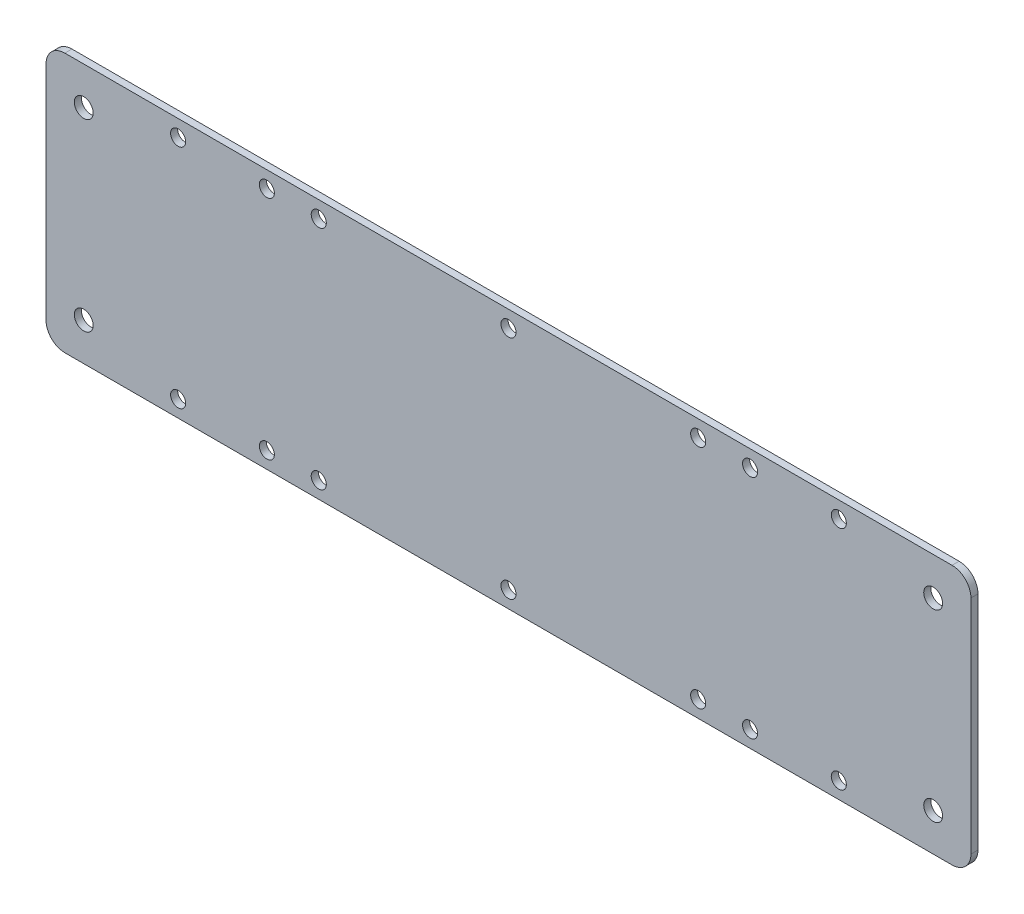
ISO-10303-21;
HEADER;
FILE_DESCRIPTION(('STEP AP214'),'2;1');
FILE_NAME('part.step','',(''),(''),'','','');
FILE_SCHEMA(('AUTOMOTIVE_DESIGN { 1 0 10303 214 1 1 1 1 }'));
ENDSEC;
DATA;
#1=APPLICATION_CONTEXT('core data for automotive mechanical design processes');
#2=APPLICATION_PROTOCOL_DEFINITION('international standard','automotive_design',2000,#1);
#3=PRODUCT_CONTEXT('',#1,'mechanical');
#4=PRODUCT('Part','Part','',(#3));
#5=PRODUCT_RELATED_PRODUCT_CATEGORY('part','',(#4));
#6=PRODUCT_DEFINITION_FORMATION('','',#4);
#7=PRODUCT_DEFINITION_CONTEXT('part definition',#1,'design');
#8=PRODUCT_DEFINITION('design','',#6,#7);
#9=PRODUCT_DEFINITION_SHAPE('','',#8);
#10=(LENGTH_UNIT() NAMED_UNIT(*) SI_UNIT(.MILLI.,.METRE.));
#11=(NAMED_UNIT(*) PLANE_ANGLE_UNIT() SI_UNIT($,.RADIAN.));
#12=(NAMED_UNIT(*) SI_UNIT($,.STERADIAN.) SOLID_ANGLE_UNIT());
#13=UNCERTAINTY_MEASURE_WITH_UNIT(LENGTH_MEASURE(1.E-05),#10,'distance_accuracy_value','');
#14=(GEOMETRIC_REPRESENTATION_CONTEXT(3) GLOBAL_UNCERTAINTY_ASSIGNED_CONTEXT((#13)) GLOBAL_UNIT_ASSIGNED_CONTEXT((#10,
#11,#12)) REPRESENTATION_CONTEXT('',''));
#15=CARTESIAN_POINT('',(0.,0.,0.));
#16=DIRECTION('',(0.,0.,1.));
#17=DIRECTION('',(1.,0.,0.));
#18=AXIS2_PLACEMENT_3D('',#15,#16,#17);
#19=CARTESIAN_POINT('',(-98.,27.4999999999999,1.5));
#20=DIRECTION('',(1.,0.,0.));
#21=DIRECTION('',(0.,1.,0.));
#22=AXIS2_PLACEMENT_3D('',#19,#20,#21);
#23=PLANE('',#22);
#24=DIRECTION('',(0.,-1.,0.));
#25=VECTOR('',#24,1.);
#26=CARTESIAN_POINT('',(-98.,27.4999999999999,0.));
#27=LINE('',#26,#25);
#28=CARTESIAN_POINT('',(-98.,23.4999999999999,0.));
#29=VERTEX_POINT('',#28);
#30=CARTESIAN_POINT('',(-98.,-23.5,0.));
#31=VERTEX_POINT('',#30);
#32=EDGE_CURVE('E151',#29,#31,#27,.T.);
#33=ORIENTED_EDGE('',*,*,#32,.T.);
#34=DIRECTION('',(0.,0.,-1.));
#35=VECTOR('',#34,1.);
#36=CARTESIAN_POINT('',(-98.,-23.5,1.5));
#37=LINE('',#36,#35);
#38=CARTESIAN_POINT('',(-98.,-23.5,1.5));
#39=VERTEX_POINT('',#38);
#40=EDGE_CURVE('E11',#31,#39,#37,.F.);
#41=ORIENTED_EDGE('',*,*,#40,.T.);
#42=DIRECTION('',(0.,-1.,0.));
#43=VECTOR('',#42,1.);
#44=CARTESIAN_POINT('',(-98.,27.4999999999999,1.5));
#45=LINE('',#44,#43);
#46=CARTESIAN_POINT('',(-98.,23.4999999999999,1.5));
#47=VERTEX_POINT('',#46);
#48=EDGE_CURVE('E154',#47,#39,#45,.T.);
#49=ORIENTED_EDGE('',*,*,#48,.F.);
#50=DIRECTION('',(0.,0.,-1.));
#51=VECTOR('',#50,1.);
#52=CARTESIAN_POINT('',(-98.,23.4999999999999,0.));
#53=LINE('',#52,#51);
#54=EDGE_CURVE('E40',#47,#29,#53,.T.);
#55=ORIENTED_EDGE('',*,*,#54,.T.);
#56=EDGE_LOOP('',(#33,#41,#49,#55));
#57=FACE_BOUND('',#56,.T.);
#58=ADVANCED_FACE('F32',(#57),#23,.F.);
#59=CARTESIAN_POINT('',(-98.,-27.5,1.5));
#60=DIRECTION('',(0.,1.,0.));
#61=DIRECTION('',(0.,0.,1.));
#62=AXIS2_PLACEMENT_3D('',#59,#60,#61);
#63=PLANE('',#62);
#64=DIRECTION('',(1.,0.,0.));
#65=VECTOR('',#64,1.);
#66=CARTESIAN_POINT('',(-98.,-27.5,0.));
#67=LINE('',#66,#65);
#68=CARTESIAN_POINT('',(-94.,-27.5,0.));
#69=VERTEX_POINT('',#68);
#70=CARTESIAN_POINT('',(94.,-27.5,0.));
#71=VERTEX_POINT('',#70);
#72=EDGE_CURVE('E117',#69,#71,#67,.T.);
#73=ORIENTED_EDGE('',*,*,#72,.T.);
#74=DIRECTION('',(0.,0.,-1.));
#75=VECTOR('',#74,1.);
#76=CARTESIAN_POINT('',(94.,-27.5,1.5));
#77=LINE('',#76,#75);
#78=CARTESIAN_POINT('',(94.,-27.5,1.5));
#79=VERTEX_POINT('',#78);
#80=EDGE_CURVE('E134',#71,#79,#77,.F.);
#81=ORIENTED_EDGE('',*,*,#80,.T.);
#82=DIRECTION('',(1.,0.,0.));
#83=VECTOR('',#82,1.);
#84=CARTESIAN_POINT('',(-98.,-27.5,1.5));
#85=LINE('',#84,#83);
#86=CARTESIAN_POINT('',(-94.,-27.5,1.5));
#87=VERTEX_POINT('',#86);
#88=EDGE_CURVE('E167',#87,#79,#85,.T.);
#89=ORIENTED_EDGE('',*,*,#88,.F.);
#90=DIRECTION('',(0.,0.,-1.));
#91=VECTOR('',#90,1.);
#92=CARTESIAN_POINT('',(-94.,-27.5,1.5));
#93=LINE('',#92,#91);
#94=EDGE_CURVE('E131',#87,#69,#93,.T.);
#95=ORIENTED_EDGE('',*,*,#94,.T.);
#96=EDGE_LOOP('',(#73,#81,#89,#95));
#97=FACE_BOUND('',#96,.T.);
#98=ADVANCED_FACE('F318',(#97),#63,.F.);
#99=CARTESIAN_POINT('',(98.,27.5,1.5));
#100=DIRECTION('',(1.,0.,0.));
#101=DIRECTION('',(0.,1.,0.));
#102=AXIS2_PLACEMENT_3D('',#99,#100,#101);
#103=PLANE('',#102);
#104=DIRECTION('',(0.,-1.,0.));
#105=VECTOR('',#104,1.);
#106=CARTESIAN_POINT('',(98.,27.5,1.5));
#107=LINE('',#106,#105);
#108=CARTESIAN_POINT('',(98.,23.5,1.5));
#109=VERTEX_POINT('',#108);
#110=CARTESIAN_POINT('',(98.,-23.5,1.5));
#111=VERTEX_POINT('',#110);
#112=EDGE_CURVE('E124',#109,#111,#107,.T.);
#113=ORIENTED_EDGE('',*,*,#112,.T.);
#114=DIRECTION('',(0.,0.,-1.));
#115=VECTOR('',#114,1.);
#116=CARTESIAN_POINT('',(98.,-23.5,0.));
#117=LINE('',#116,#115);
#118=CARTESIAN_POINT('',(98.,-23.5,0.));
#119=VERTEX_POINT('',#118);
#120=EDGE_CURVE('E116',#111,#119,#117,.T.);
#121=ORIENTED_EDGE('',*,*,#120,.T.);
#122=DIRECTION('',(0.,-1.,0.));
#123=VECTOR('',#122,1.);
#124=CARTESIAN_POINT('',(98.,27.5,0.));
#125=LINE('',#124,#123);
#126=CARTESIAN_POINT('',(98.,23.5,0.));
#127=VERTEX_POINT('',#126);
#128=EDGE_CURVE('E101',#127,#119,#125,.T.);
#129=ORIENTED_EDGE('',*,*,#128,.F.);
#130=DIRECTION('',(0.,0.,-1.));
#131=VECTOR('',#130,1.);
#132=CARTESIAN_POINT('',(98.,23.5,1.5));
#133=LINE('',#132,#131);
#134=EDGE_CURVE('E114',#127,#109,#133,.F.);
#135=ORIENTED_EDGE('',*,*,#134,.T.);
#136=EDGE_LOOP('',(#113,#121,#129,#135));
#137=FACE_BOUND('',#136,.T.);
#138=ADVANCED_FACE('F113',(#137),#103,.T.);
#139=CARTESIAN_POINT('',(-98.,27.4999999999999,1.5));
#140=DIRECTION('',(0.,1.,0.));
#141=DIRECTION('',(-1.,0.,0.));
#142=AXIS2_PLACEMENT_3D('',#139,#140,#141);
#143=PLANE('',#142);
#144=DIRECTION('',(1.,0.,0.));
#145=VECTOR('',#144,1.);
#146=CARTESIAN_POINT('',(-98.,27.4999999999999,1.5));
#147=LINE('',#146,#145);
#148=CARTESIAN_POINT('',(-94.,27.4999999999999,1.5));
#149=VERTEX_POINT('',#148);
#150=CARTESIAN_POINT('',(94.,27.5,1.5));
#151=VERTEX_POINT('',#150);
#152=EDGE_CURVE('E120',#149,#151,#147,.T.);
#153=ORIENTED_EDGE('',*,*,#152,.T.);
#154=DIRECTION('',(0.,0.,-1.));
#155=VECTOR('',#154,1.);
#156=CARTESIAN_POINT('',(94.,27.5,1.5));
#157=LINE('',#156,#155);
#158=CARTESIAN_POINT('',(94.,27.5,0.));
#159=VERTEX_POINT('',#158);
#160=EDGE_CURVE('E144',#151,#159,#157,.T.);
#161=ORIENTED_EDGE('',*,*,#160,.T.);
#162=DIRECTION('',(1.,0.,0.));
#163=VECTOR('',#162,1.);
#164=CARTESIAN_POINT('',(-98.,27.4999999999999,0.));
#165=LINE('',#164,#163);
#166=CARTESIAN_POINT('',(-94.,27.4999999999999,0.));
#167=VERTEX_POINT('',#166);
#168=EDGE_CURVE('E102',#167,#159,#165,.T.);
#169=ORIENTED_EDGE('',*,*,#168,.F.);
#170=DIRECTION('',(0.,0.,-1.));
#171=VECTOR('',#170,1.);
#172=CARTESIAN_POINT('',(-94.,27.4999999999999,1.5));
#173=LINE('',#172,#171);
#174=EDGE_CURVE('E54',#167,#149,#173,.F.);
#175=ORIENTED_EDGE('',*,*,#174,.T.);
#176=EDGE_LOOP('',(#153,#161,#169,#175));
#177=FACE_BOUND('',#176,.T.);
#178=ADVANCED_FACE('F282',(#177),#143,.T.);
#179=CARTESIAN_POINT('',(0.,0.,1.5));
#180=DIRECTION('',(0.,0.,1.));
#181=DIRECTION('',(1.,0.,0.));
#182=AXIS2_PLACEMENT_3D('',#179,#180,#181);
#183=PLANE('',#182);
#184=CARTESIAN_POINT('',(-70.,-23.9999999999999,1.5));
#185=DIRECTION('',(0.,0.,1.));
#186=DIRECTION('',(-1.,0.,0.));
#187=AXIS2_PLACEMENT_3D('',#184,#185,#186);
#188=CIRCLE('',#187,1.6);
#189=CARTESIAN_POINT('',(-71.6,-23.9999999999999,1.5));
#190=VERTEX_POINT('',#189);
#191=EDGE_CURVE('E250',#190,#190,#188,.T.);
#192=ORIENTED_EDGE('',*,*,#191,.F.);
#193=EDGE_LOOP('',(#192));
#194=FACE_BOUND('',#193,.T.);
#195=CARTESIAN_POINT('',(0.,-23.9999999999999,1.5));
#196=DIRECTION('',(0.,0.,1.));
#197=DIRECTION('',(-1.,0.,0.));
#198=AXIS2_PLACEMENT_3D('',#195,#196,#197);
#199=CIRCLE('',#198,1.6);
#200=CARTESIAN_POINT('',(-1.6,-23.9999999999999,1.5));
#201=VERTEX_POINT('',#200);
#202=EDGE_CURVE('E249',#201,#201,#199,.T.);
#203=ORIENTED_EDGE('',*,*,#202,.F.);
#204=EDGE_LOOP('',(#203));
#205=FACE_BOUND('',#204,.T.);
#206=CARTESIAN_POINT('',(70.,-23.9999999999999,1.5));
#207=DIRECTION('',(0.,0.,1.));
#208=DIRECTION('',(-1.,0.,0.));
#209=AXIS2_PLACEMENT_3D('',#206,#207,#208);
#210=CIRCLE('',#209,1.6);
#211=CARTESIAN_POINT('',(68.4,-23.9999999999999,1.5));
#212=VERTEX_POINT('',#211);
#213=EDGE_CURVE('E256',#212,#212,#210,.T.);
#214=ORIENTED_EDGE('',*,*,#213,.F.);
#215=EDGE_LOOP('',(#214));
#216=FACE_BOUND('',#215,.T.);
#217=CARTESIAN_POINT('',(70.,23.9999999999999,1.5));
#218=DIRECTION('',(0.,0.,1.));
#219=DIRECTION('',(1.,0.,0.));
#220=AXIS2_PLACEMENT_3D('',#217,#218,#219);
#221=CIRCLE('',#220,1.6);
#222=CARTESIAN_POINT('',(71.6,23.9999999999999,1.5));
#223=VERTEX_POINT('',#222);
#224=EDGE_CURVE('E262',#223,#223,#221,.T.);
#225=ORIENTED_EDGE('',*,*,#224,.F.);
#226=EDGE_LOOP('',(#225));
#227=FACE_BOUND('',#226,.T.);
#228=CARTESIAN_POINT('',(0.,23.9999999999999,1.5));
#229=DIRECTION('',(0.,0.,1.));
#230=DIRECTION('',(1.,0.,0.));
#231=AXIS2_PLACEMENT_3D('',#228,#229,#230);
#232=CIRCLE('',#231,1.6);
#233=CARTESIAN_POINT('',(1.6,23.9999999999999,1.5));
#234=VERTEX_POINT('',#233);
#235=EDGE_CURVE('E268',#234,#234,#232,.T.);
#236=ORIENTED_EDGE('',*,*,#235,.F.);
#237=EDGE_LOOP('',(#236));
#238=FACE_BOUND('',#237,.T.);
#239=CARTESIAN_POINT('',(-70.,23.9999999999999,1.5));
#240=DIRECTION('',(0.,0.,1.));
#241=DIRECTION('',(1.,0.,0.));
#242=AXIS2_PLACEMENT_3D('',#239,#240,#241);
#243=CIRCLE('',#242,1.6);
#244=CARTESIAN_POINT('',(-68.4,23.9999999999999,1.5));
#245=VERTEX_POINT('',#244);
#246=EDGE_CURVE('E242',#245,#245,#243,.T.);
#247=ORIENTED_EDGE('',*,*,#246,.F.);
#248=EDGE_LOOP('',(#247));
#249=FACE_BOUND('',#248,.T.);
#250=CARTESIAN_POINT('',(40.2,-24.,1.5));
#251=DIRECTION('',(0.,0.,1.));
#252=DIRECTION('',(-1.,0.,0.));
#253=AXIS2_PLACEMENT_3D('',#250,#251,#252);
#254=CIRCLE('',#253,1.6);
#255=CARTESIAN_POINT('',(38.6,-24.,1.5));
#256=VERTEX_POINT('',#255);
#257=EDGE_CURVE('E214',#256,#256,#254,.T.);
#258=ORIENTED_EDGE('',*,*,#257,.F.);
#259=EDGE_LOOP('',(#258));
#260=FACE_BOUND('',#259,.T.);
#261=CARTESIAN_POINT('',(-51.2,-24.,1.5));
#262=DIRECTION('',(0.,0.,1.));
#263=DIRECTION('',(1.,0.,0.));
#264=AXIS2_PLACEMENT_3D('',#261,#262,#263);
#265=CIRCLE('',#264,1.6);
#266=CARTESIAN_POINT('',(-49.6,-24.,1.5));
#267=VERTEX_POINT('',#266);
#268=EDGE_CURVE('E213',#267,#267,#265,.T.);
#269=ORIENTED_EDGE('',*,*,#268,.F.);
#270=EDGE_LOOP('',(#269));
#271=FACE_BOUND('',#270,.T.);
#272=CARTESIAN_POINT('',(-40.2,-24.,1.5));
#273=DIRECTION('',(0.,0.,1.));
#274=DIRECTION('',(1.,0.,0.));
#275=AXIS2_PLACEMENT_3D('',#272,#273,#274);
#276=CIRCLE('',#275,1.6);
#277=CARTESIAN_POINT('',(-38.6,-24.,1.5));
#278=VERTEX_POINT('',#277);
#279=EDGE_CURVE('E202',#278,#278,#276,.T.);
#280=ORIENTED_EDGE('',*,*,#279,.F.);
#281=EDGE_LOOP('',(#280));
#282=FACE_BOUND('',#281,.T.);
#283=CARTESIAN_POINT('',(-40.2,24.,1.5));
#284=DIRECTION('',(0.,0.,1.));
#285=DIRECTION('',(1.,0.,0.));
#286=AXIS2_PLACEMENT_3D('',#283,#284,#285);
#287=CIRCLE('',#286,1.6);
#288=CARTESIAN_POINT('',(-38.6,24.,1.5));
#289=VERTEX_POINT('',#288);
#290=EDGE_CURVE('E201',#289,#289,#287,.T.);
#291=ORIENTED_EDGE('',*,*,#290,.F.);
#292=EDGE_LOOP('',(#291));
#293=FACE_BOUND('',#292,.T.);
#294=CARTESIAN_POINT('',(51.2,-24.,1.5));
#295=DIRECTION('',(0.,0.,1.));
#296=DIRECTION('',(-1.,0.,0.));
#297=AXIS2_PLACEMENT_3D('',#294,#295,#296);
#298=CIRCLE('',#297,1.6);
#299=CARTESIAN_POINT('',(49.6,-24.,1.5));
#300=VERTEX_POINT('',#299);
#301=EDGE_CURVE('E233',#300,#300,#298,.T.);
#302=ORIENTED_EDGE('',*,*,#301,.F.);
#303=EDGE_LOOP('',(#302));
#304=FACE_BOUND('',#303,.T.);
#305=CARTESIAN_POINT('',(51.2,24.,1.5));
#306=DIRECTION('',(0.,0.,1.));
#307=DIRECTION('',(-1.,0.,0.));
#308=AXIS2_PLACEMENT_3D('',#305,#306,#307);
#309=CIRCLE('',#308,1.6);
#310=CARTESIAN_POINT('',(49.6,24.,1.5));
#311=VERTEX_POINT('',#310);
#312=EDGE_CURVE('E225',#311,#311,#309,.T.);
#313=ORIENTED_EDGE('',*,*,#312,.F.);
#314=EDGE_LOOP('',(#313));
#315=FACE_BOUND('',#314,.T.);
#316=CARTESIAN_POINT('',(40.2,24.,1.5));
#317=DIRECTION('',(0.,0.,1.));
#318=DIRECTION('',(-1.,0.,0.));
#319=AXIS2_PLACEMENT_3D('',#316,#317,#318);
#320=CIRCLE('',#319,1.6);
#321=CARTESIAN_POINT('',(38.6,24.,1.5));
#322=VERTEX_POINT('',#321);
#323=EDGE_CURVE('E226',#322,#322,#320,.T.);
#324=ORIENTED_EDGE('',*,*,#323,.F.);
#325=EDGE_LOOP('',(#324));
#326=FACE_BOUND('',#325,.T.);
#327=CARTESIAN_POINT('',(-51.2,24.,1.5));
#328=DIRECTION('',(0.,0.,1.));
#329=DIRECTION('',(1.,0.,0.));
#330=AXIS2_PLACEMENT_3D('',#327,#328,#329);
#331=CIRCLE('',#330,1.6);
#332=CARTESIAN_POINT('',(-49.6,24.,1.5));
#333=VERTEX_POINT('',#332);
#334=EDGE_CURVE('E194',#333,#333,#331,.T.);
#335=ORIENTED_EDGE('',*,*,#334,.F.);
#336=EDGE_LOOP('',(#335));
#337=FACE_BOUND('',#336,.T.);
#338=CARTESIAN_POINT('',(-90.,-19.4999999999999,1.5));
#339=DIRECTION('',(0.,0.,1.));
#340=DIRECTION('',(1.,0.,0.));
#341=AXIS2_PLACEMENT_3D('',#338,#339,#340);
#342=CIRCLE('',#341,2.);
#343=CARTESIAN_POINT('',(-88.,-19.4999999999999,1.5));
#344=VERTEX_POINT('',#343);
#345=EDGE_CURVE('E181',#344,#344,#342,.T.);
#346=ORIENTED_EDGE('',*,*,#345,.F.);
#347=EDGE_LOOP('',(#346));
#348=FACE_BOUND('',#347,.T.);
#349=CARTESIAN_POINT('',(90.,19.4999999999999,1.5));
#350=DIRECTION('',(0.,0.,1.));
#351=DIRECTION('',(1.,0.,0.));
#352=AXIS2_PLACEMENT_3D('',#349,#350,#351);
#353=CIRCLE('',#352,2.);
#354=CARTESIAN_POINT('',(92.,19.4999999999999,1.5));
#355=VERTEX_POINT('',#354);
#356=EDGE_CURVE('E174',#355,#355,#353,.T.);
#357=ORIENTED_EDGE('',*,*,#356,.F.);
#358=EDGE_LOOP('',(#357));
#359=FACE_BOUND('',#358,.T.);
#360=CARTESIAN_POINT('',(90.,-19.4999999999999,1.5));
#361=DIRECTION('',(0.,0.,1.));
#362=DIRECTION('',(1.,0.,0.));
#363=AXIS2_PLACEMENT_3D('',#360,#361,#362);
#364=CIRCLE('',#363,2.);
#365=CARTESIAN_POINT('',(92.,-19.4999999999999,1.5));
#366=VERTEX_POINT('',#365);
#367=EDGE_CURVE('E186',#366,#366,#364,.T.);
#368=ORIENTED_EDGE('',*,*,#367,.F.);
#369=EDGE_LOOP('',(#368));
#370=FACE_BOUND('',#369,.T.);
#371=CARTESIAN_POINT('',(-90.,19.4999999999999,1.5));
#372=DIRECTION('',(0.,0.,1.));
#373=DIRECTION('',(1.,0.,0.));
#374=AXIS2_PLACEMENT_3D('',#371,#372,#373);
#375=CIRCLE('',#374,2.);
#376=CARTESIAN_POINT('',(-88.,19.4999999999999,1.5));
#377=VERTEX_POINT('',#376);
#378=EDGE_CURVE('E163',#377,#377,#375,.T.);
#379=ORIENTED_EDGE('',*,*,#378,.F.);
#380=EDGE_LOOP('',(#379));
#381=FACE_BOUND('',#380,.T.);
#382=ORIENTED_EDGE('',*,*,#88,.T.);
#383=CARTESIAN_POINT('',(94.,-23.5,1.5));
#384=DIRECTION('',(0.,0.,1.));
#385=DIRECTION('',(1.,0.,0.));
#386=AXIS2_PLACEMENT_3D('',#383,#384,#385);
#387=CIRCLE('',#386,4.);
#388=EDGE_CURVE('E141',#79,#111,#387,.T.);
#389=ORIENTED_EDGE('',*,*,#388,.T.);
#390=ORIENTED_EDGE('',*,*,#112,.F.);
#391=CARTESIAN_POINT('',(94.,23.5,1.5));
#392=DIRECTION('',(0.,0.,1.));
#393=DIRECTION('',(1.,0.,0.));
#394=AXIS2_PLACEMENT_3D('',#391,#392,#393);
#395=CIRCLE('',#394,4.);
#396=EDGE_CURVE('E47',#109,#151,#395,.T.);
#397=ORIENTED_EDGE('',*,*,#396,.T.);
#398=ORIENTED_EDGE('',*,*,#152,.F.);
#399=CARTESIAN_POINT('',(-94.,23.4999999999999,1.5));
#400=DIRECTION('',(0.,0.,1.));
#401=DIRECTION('',(1.,0.,0.));
#402=AXIS2_PLACEMENT_3D('',#399,#400,#401);
#403=CIRCLE('',#402,4.);
#404=EDGE_CURVE('E136',#149,#47,#403,.T.);
#405=ORIENTED_EDGE('',*,*,#404,.T.);
#406=ORIENTED_EDGE('',*,*,#48,.T.);
#407=CARTESIAN_POINT('',(-94.,-23.5,1.5));
#408=DIRECTION('',(0.,0.,1.));
#409=DIRECTION('',(1.,0.,0.));
#410=AXIS2_PLACEMENT_3D('',#407,#408,#409);
#411=CIRCLE('',#410,4.);
#412=EDGE_CURVE('E138',#39,#87,#411,.T.);
#413=ORIENTED_EDGE('',*,*,#412,.T.);
#414=EDGE_LOOP('',(#382,#389,#390,#397,#398,#405,#406,#413));
#415=FACE_BOUND('',#414,.T.);
#416=ADVANCED_FACE('F279',(#194,#205,#216,#227,#238,#249,#260,#271,#282,#293,#304,#315,#326,
#337,#348,#359,#370,#381,#415),#183,.T.);
#417=CARTESIAN_POINT('',(0.,0.,0.));
#418=DIRECTION('',(0.,0.,1.));
#419=DIRECTION('',(1.,0.,0.));
#420=AXIS2_PLACEMENT_3D('',#417,#418,#419);
#421=PLANE('',#420);
#422=CARTESIAN_POINT('',(-70.,-23.9999999999999,0.));
#423=DIRECTION('',(0.,0.,1.));
#424=DIRECTION('',(1.,0.,0.));
#425=AXIS2_PLACEMENT_3D('',#422,#423,#424);
#426=CIRCLE('',#425,1.6);
#427=CARTESIAN_POINT('',(-68.4,-23.9999999999999,0.));
#428=VERTEX_POINT('',#427);
#429=EDGE_CURVE('E246',#428,#428,#426,.F.);
#430=ORIENTED_EDGE('',*,*,#429,.F.);
#431=EDGE_LOOP('',(#430));
#432=FACE_BOUND('',#431,.T.);
#433=CARTESIAN_POINT('',(0.,-23.9999999999999,0.));
#434=DIRECTION('',(0.,0.,1.));
#435=DIRECTION('',(1.,0.,0.));
#436=AXIS2_PLACEMENT_3D('',#433,#434,#435);
#437=CIRCLE('',#436,1.6);
#438=CARTESIAN_POINT('',(1.6,-23.9999999999999,0.));
#439=VERTEX_POINT('',#438);
#440=EDGE_CURVE('E253',#439,#439,#437,.F.);
#441=ORIENTED_EDGE('',*,*,#440,.F.);
#442=EDGE_LOOP('',(#441));
#443=FACE_BOUND('',#442,.T.);
#444=CARTESIAN_POINT('',(70.,-23.9999999999999,0.));
#445=DIRECTION('',(0.,0.,1.));
#446=DIRECTION('',(1.,0.,0.));
#447=AXIS2_PLACEMENT_3D('',#444,#445,#446);
#448=CIRCLE('',#447,1.6);
#449=CARTESIAN_POINT('',(71.6,-23.9999999999999,0.));
#450=VERTEX_POINT('',#449);
#451=EDGE_CURVE('E259',#450,#450,#448,.F.);
#452=ORIENTED_EDGE('',*,*,#451,.F.);
#453=EDGE_LOOP('',(#452));
#454=FACE_BOUND('',#453,.T.);
#455=CARTESIAN_POINT('',(70.,23.9999999999999,0.));
#456=DIRECTION('',(0.,0.,1.));
#457=DIRECTION('',(1.,0.,0.));
#458=AXIS2_PLACEMENT_3D('',#455,#456,#457);
#459=CIRCLE('',#458,1.6);
#460=CARTESIAN_POINT('',(71.6,23.9999999999999,0.));
#461=VERTEX_POINT('',#460);
#462=EDGE_CURVE('E265',#461,#461,#459,.F.);
#463=ORIENTED_EDGE('',*,*,#462,.F.);
#464=EDGE_LOOP('',(#463));
#465=FACE_BOUND('',#464,.T.);
#466=CARTESIAN_POINT('',(0.,23.9999999999999,0.));
#467=DIRECTION('',(0.,0.,1.));
#468=DIRECTION('',(1.,0.,0.));
#469=AXIS2_PLACEMENT_3D('',#466,#467,#468);
#470=CIRCLE('',#469,1.6);
#471=CARTESIAN_POINT('',(1.6,23.9999999999999,0.));
#472=VERTEX_POINT('',#471);
#473=EDGE_CURVE('E245',#472,#472,#470,.F.);
#474=ORIENTED_EDGE('',*,*,#473,.F.);
#475=EDGE_LOOP('',(#474));
#476=FACE_BOUND('',#475,.T.);
#477=CARTESIAN_POINT('',(-70.,23.9999999999999,0.));
#478=DIRECTION('',(0.,0.,1.));
#479=DIRECTION('',(1.,0.,0.));
#480=AXIS2_PLACEMENT_3D('',#477,#478,#479);
#481=CIRCLE('',#480,1.6);
#482=CARTESIAN_POINT('',(-68.4,23.9999999999999,0.));
#483=VERTEX_POINT('',#482);
#484=EDGE_CURVE('E229',#483,#483,#481,.F.);
#485=ORIENTED_EDGE('',*,*,#484,.F.);
#486=EDGE_LOOP('',(#485));
#487=FACE_BOUND('',#486,.T.);
#488=CARTESIAN_POINT('',(40.2,-24.,0.));
#489=DIRECTION('',(0.,0.,1.));
#490=DIRECTION('',(1.,0.,0.));
#491=AXIS2_PLACEMENT_3D('',#488,#489,#490);
#492=CIRCLE('',#491,1.6);
#493=CARTESIAN_POINT('',(41.8,-24.,0.));
#494=VERTEX_POINT('',#493);
#495=EDGE_CURVE('E210',#494,#494,#492,.F.);
#496=ORIENTED_EDGE('',*,*,#495,.F.);
#497=EDGE_LOOP('',(#496));
#498=FACE_BOUND('',#497,.T.);
#499=CARTESIAN_POINT('',(-51.2,-24.,0.));
#500=DIRECTION('',(0.,0.,1.));
#501=DIRECTION('',(1.,0.,0.));
#502=AXIS2_PLACEMENT_3D('',#499,#500,#501);
#503=CIRCLE('',#502,1.6);
#504=CARTESIAN_POINT('',(-49.6,-24.,0.));
#505=VERTEX_POINT('',#504);
#506=EDGE_CURVE('E205',#505,#505,#503,.F.);
#507=ORIENTED_EDGE('',*,*,#506,.F.);
#508=EDGE_LOOP('',(#507));
#509=FACE_BOUND('',#508,.T.);
#510=CARTESIAN_POINT('',(-40.2,-24.,0.));
#511=DIRECTION('',(0.,0.,1.));
#512=DIRECTION('',(1.,0.,0.));
#513=AXIS2_PLACEMENT_3D('',#510,#511,#512);
#514=CIRCLE('',#513,1.6);
#515=CARTESIAN_POINT('',(-38.6,-24.,0.));
#516=VERTEX_POINT('',#515);
#517=EDGE_CURVE('E198',#516,#516,#514,.F.);
#518=ORIENTED_EDGE('',*,*,#517,.F.);
#519=EDGE_LOOP('',(#518));
#520=FACE_BOUND('',#519,.T.);
#521=CARTESIAN_POINT('',(-40.2,24.,0.));
#522=DIRECTION('',(0.,0.,1.));
#523=DIRECTION('',(1.,0.,0.));
#524=AXIS2_PLACEMENT_3D('',#521,#522,#523);
#525=CIRCLE('',#524,1.6);
#526=CARTESIAN_POINT('',(-38.6,24.,0.));
#527=VERTEX_POINT('',#526);
#528=EDGE_CURVE('E197',#527,#527,#525,.F.);
#529=ORIENTED_EDGE('',*,*,#528,.F.);
#530=EDGE_LOOP('',(#529));
#531=FACE_BOUND('',#530,.T.);
#532=CARTESIAN_POINT('',(51.2,-24.,0.));
#533=DIRECTION('',(0.,0.,1.));
#534=DIRECTION('',(1.,0.,0.));
#535=AXIS2_PLACEMENT_3D('',#532,#533,#534);
#536=CIRCLE('',#535,1.6);
#537=CARTESIAN_POINT('',(52.8,-24.,0.));
#538=VERTEX_POINT('',#537);
#539=EDGE_CURVE('E217',#538,#538,#536,.F.);
#540=ORIENTED_EDGE('',*,*,#539,.F.);
#541=EDGE_LOOP('',(#540));
#542=FACE_BOUND('',#541,.T.);
#543=CARTESIAN_POINT('',(51.2,24.,0.));
#544=DIRECTION('',(0.,0.,1.));
#545=DIRECTION('',(1.,0.,0.));
#546=AXIS2_PLACEMENT_3D('',#543,#544,#545);
#547=CIRCLE('',#546,1.6);
#548=CARTESIAN_POINT('',(52.8,24.,0.));
#549=VERTEX_POINT('',#548);
#550=EDGE_CURVE('E230',#549,#549,#547,.F.);
#551=ORIENTED_EDGE('',*,*,#550,.F.);
#552=EDGE_LOOP('',(#551));
#553=FACE_BOUND('',#552,.T.);
#554=CARTESIAN_POINT('',(40.2,24.,0.));
#555=DIRECTION('',(0.,0.,1.));
#556=DIRECTION('',(1.,0.,0.));
#557=AXIS2_PLACEMENT_3D('',#554,#555,#556);
#558=CIRCLE('',#557,1.6);
#559=CARTESIAN_POINT('',(41.8,24.,0.));
#560=VERTEX_POINT('',#559);
#561=EDGE_CURVE('E222',#560,#560,#558,.F.);
#562=ORIENTED_EDGE('',*,*,#561,.F.);
#563=EDGE_LOOP('',(#562));
#564=FACE_BOUND('',#563,.T.);
#565=CARTESIAN_POINT('',(-51.2,24.,0.));
#566=DIRECTION('',(0.,0.,1.));
#567=DIRECTION('',(1.,0.,0.));
#568=AXIS2_PLACEMENT_3D('',#565,#566,#567);
#569=CIRCLE('',#568,1.6);
#570=CARTESIAN_POINT('',(-49.6,24.,0.));
#571=VERTEX_POINT('',#570);
#572=EDGE_CURVE('E189',#571,#571,#569,.F.);
#573=ORIENTED_EDGE('',*,*,#572,.F.);
#574=EDGE_LOOP('',(#573));
#575=FACE_BOUND('',#574,.T.);
#576=CARTESIAN_POINT('',(-90.,-19.4999999999999,0.));
#577=DIRECTION('',(0.,0.,1.));
#578=DIRECTION('',(1.,0.,0.));
#579=AXIS2_PLACEMENT_3D('',#576,#577,#578);
#580=CIRCLE('',#579,2.);
#581=CARTESIAN_POINT('',(-88.,-19.4999999999999,0.));
#582=VERTEX_POINT('',#581);
#583=EDGE_CURVE('E172',#582,#582,#580,.T.);
#584=ORIENTED_EDGE('',*,*,#583,.T.);
#585=EDGE_LOOP('',(#584));
#586=FACE_BOUND('',#585,.T.);
#587=CARTESIAN_POINT('',(90.,19.4999999999999,0.));
#588=DIRECTION('',(0.,0.,1.));
#589=DIRECTION('',(1.,0.,0.));
#590=AXIS2_PLACEMENT_3D('',#587,#588,#589);
#591=CIRCLE('',#590,2.);
#592=CARTESIAN_POINT('',(92.,19.4999999999999,0.));
#593=VERTEX_POINT('',#592);
#594=EDGE_CURVE('E177',#593,#593,#591,.T.);
#595=ORIENTED_EDGE('',*,*,#594,.T.);
#596=EDGE_LOOP('',(#595));
#597=FACE_BOUND('',#596,.T.);
#598=CARTESIAN_POINT('',(90.,-19.4999999999999,0.));
#599=DIRECTION('',(0.,0.,1.));
#600=DIRECTION('',(1.,0.,0.));
#601=AXIS2_PLACEMENT_3D('',#598,#599,#600);
#602=CIRCLE('',#601,2.);
#603=CARTESIAN_POINT('',(92.,-19.4999999999999,0.));
#604=VERTEX_POINT('',#603);
#605=EDGE_CURVE('E178',#604,#604,#602,.T.);
#606=ORIENTED_EDGE('',*,*,#605,.T.);
#607=EDGE_LOOP('',(#606));
#608=FACE_BOUND('',#607,.T.);
#609=CARTESIAN_POINT('',(-90.,19.4999999999999,0.));
#610=DIRECTION('',(0.,0.,1.));
#611=DIRECTION('',(1.,0.,0.));
#612=AXIS2_PLACEMENT_3D('',#609,#610,#611);
#613=CIRCLE('',#612,2.);
#614=CARTESIAN_POINT('',(-88.,19.4999999999999,0.));
#615=VERTEX_POINT('',#614);
#616=EDGE_CURVE('E158',#615,#615,#613,.T.);
#617=ORIENTED_EDGE('',*,*,#616,.T.);
#618=EDGE_LOOP('',(#617));
#619=FACE_BOUND('',#618,.T.);
#620=ORIENTED_EDGE('',*,*,#128,.T.);
#621=CARTESIAN_POINT('',(94.,-23.5,0.));
#622=DIRECTION('',(0.,0.,1.));
#623=DIRECTION('',(1.,0.,0.));
#624=AXIS2_PLACEMENT_3D('',#621,#622,#623);
#625=CIRCLE('',#624,4.);
#626=EDGE_CURVE('E107',#119,#71,#625,.F.);
#627=ORIENTED_EDGE('',*,*,#626,.T.);
#628=ORIENTED_EDGE('',*,*,#72,.F.);
#629=CARTESIAN_POINT('',(-94.,-23.5,0.));
#630=DIRECTION('',(0.,0.,1.));
#631=DIRECTION('',(1.,0.,0.));
#632=AXIS2_PLACEMENT_3D('',#629,#630,#631);
#633=CIRCLE('',#632,4.);
#634=EDGE_CURVE('E108',#69,#31,#633,.F.);
#635=ORIENTED_EDGE('',*,*,#634,.T.);
#636=ORIENTED_EDGE('',*,*,#32,.F.);
#637=CARTESIAN_POINT('',(-94.,23.4999999999999,0.));
#638=DIRECTION('',(0.,0.,1.));
#639=DIRECTION('',(1.,0.,0.));
#640=AXIS2_PLACEMENT_3D('',#637,#638,#639);
#641=CIRCLE('',#640,4.);
#642=EDGE_CURVE('E122',#29,#167,#641,.F.);
#643=ORIENTED_EDGE('',*,*,#642,.T.);
#644=ORIENTED_EDGE('',*,*,#168,.T.);
#645=CARTESIAN_POINT('',(94.,23.5,0.));
#646=DIRECTION('',(0.,0.,1.));
#647=DIRECTION('',(1.,0.,0.));
#648=AXIS2_PLACEMENT_3D('',#645,#646,#647);
#649=CIRCLE('',#648,4.);
#650=EDGE_CURVE('E98',#159,#127,#649,.F.);
#651=ORIENTED_EDGE('',*,*,#650,.T.);
#652=EDGE_LOOP('',(#620,#627,#628,#635,#636,#643,#644,#651));
#653=FACE_BOUND('',#652,.T.);
#654=ADVANCED_FACE('F100',(#432,#443,#454,#465,#476,#487,#498,#509,#520,#531,#542,#553,#564,
#575,#586,#597,#608,#619,#653),#421,.F.);
#655=CARTESIAN_POINT('',(94.,-23.5,1.5));
#656=DIRECTION('',(0.,0.,1.));
#657=DIRECTION('',(1.,0.,0.));
#658=AXIS2_PLACEMENT_3D('',#655,#656,#657);
#659=CYLINDRICAL_SURFACE('',#658,4.);
#660=ORIENTED_EDGE('',*,*,#388,.F.);
#661=ORIENTED_EDGE('',*,*,#80,.F.);
#662=ORIENTED_EDGE('',*,*,#626,.F.);
#663=ORIENTED_EDGE('',*,*,#120,.F.);
#664=EDGE_LOOP('',(#660,#661,#662,#663));
#665=FACE_BOUND('',#664,.T.);
#666=ADVANCED_FACE('F317',(#665),#659,.T.);
#667=CARTESIAN_POINT('',(94.,23.5,1.5));
#668=DIRECTION('',(0.,0.,-1.));
#669=DIRECTION('',(-1.,0.,0.));
#670=AXIS2_PLACEMENT_3D('',#667,#668,#669);
#671=CYLINDRICAL_SURFACE('',#670,4.);
#672=ORIENTED_EDGE('',*,*,#396,.F.);
#673=ORIENTED_EDGE('',*,*,#134,.F.);
#674=ORIENTED_EDGE('',*,*,#650,.F.);
#675=ORIENTED_EDGE('',*,*,#160,.F.);
#676=EDGE_LOOP('',(#672,#673,#674,#675));
#677=FACE_BOUND('',#676,.T.);
#678=ADVANCED_FACE('F119',(#677),#671,.T.);
#679=CARTESIAN_POINT('',(-94.,-23.5,1.5));
#680=DIRECTION('',(0.,0.,-1.));
#681=DIRECTION('',(-1.,0.,0.));
#682=AXIS2_PLACEMENT_3D('',#679,#680,#681);
#683=CYLINDRICAL_SURFACE('',#682,4.);
#684=ORIENTED_EDGE('',*,*,#412,.F.);
#685=ORIENTED_EDGE('',*,*,#40,.F.);
#686=ORIENTED_EDGE('',*,*,#634,.F.);
#687=ORIENTED_EDGE('',*,*,#94,.F.);
#688=EDGE_LOOP('',(#684,#685,#686,#687));
#689=FACE_BOUND('',#688,.T.);
#690=ADVANCED_FACE('F320',(#689),#683,.T.);
#691=CARTESIAN_POINT('',(-94.,23.4999999999999,1.5));
#692=DIRECTION('',(0.,0.,1.));
#693=DIRECTION('',(1.,0.,0.));
#694=AXIS2_PLACEMENT_3D('',#691,#692,#693);
#695=CYLINDRICAL_SURFACE('',#694,4.);
#696=ORIENTED_EDGE('',*,*,#404,.F.);
#697=ORIENTED_EDGE('',*,*,#174,.F.);
#698=ORIENTED_EDGE('',*,*,#642,.F.);
#699=ORIENTED_EDGE('',*,*,#54,.F.);
#700=EDGE_LOOP('',(#696,#697,#698,#699));
#701=FACE_BOUND('',#700,.T.);
#702=ADVANCED_FACE('F34',(#701),#695,.T.);
#703=CARTESIAN_POINT('',(-90.,19.4999999999999,0.));
#704=DIRECTION('',(0.,0.,1.));
#705=DIRECTION('',(1.,0.,0.));
#706=AXIS2_PLACEMENT_3D('',#703,#704,#705);
#707=CYLINDRICAL_SURFACE('',#706,2.);
#708=ORIENTED_EDGE('',*,*,#616,.F.);
#709=EDGE_LOOP('',(#708));
#710=FACE_BOUND('',#709,.T.);
#711=ORIENTED_EDGE('',*,*,#378,.T.);
#712=EDGE_LOOP('',(#711));
#713=FACE_BOUND('',#712,.T.);
#714=ADVANCED_FACE('F322',(#710,#713),#707,.F.);
#715=CARTESIAN_POINT('',(90.,-19.4999999999999,0.));
#716=DIRECTION('',(0.,0.,1.));
#717=DIRECTION('',(1.,0.,0.));
#718=AXIS2_PLACEMENT_3D('',#715,#716,#717);
#719=CYLINDRICAL_SURFACE('',#718,2.);
#720=ORIENTED_EDGE('',*,*,#605,.F.);
#721=EDGE_LOOP('',(#720));
#722=FACE_BOUND('',#721,.T.);
#723=ORIENTED_EDGE('',*,*,#367,.T.);
#724=EDGE_LOOP('',(#723));
#725=FACE_BOUND('',#724,.T.);
#726=ADVANCED_FACE('F327',(#722,#725),#719,.F.);
#727=CARTESIAN_POINT('',(90.,19.4999999999999,0.));
#728=DIRECTION('',(0.,0.,1.));
#729=DIRECTION('',(1.,0.,0.));
#730=AXIS2_PLACEMENT_3D('',#727,#728,#729);
#731=CYLINDRICAL_SURFACE('',#730,2.);
#732=ORIENTED_EDGE('',*,*,#594,.F.);
#733=EDGE_LOOP('',(#732));
#734=FACE_BOUND('',#733,.T.);
#735=ORIENTED_EDGE('',*,*,#356,.T.);
#736=EDGE_LOOP('',(#735));
#737=FACE_BOUND('',#736,.T.);
#738=ADVANCED_FACE('F369',(#734,#737),#731,.F.);
#739=CARTESIAN_POINT('',(-90.,-19.4999999999999,0.));
#740=DIRECTION('',(0.,0.,1.));
#741=DIRECTION('',(1.,0.,0.));
#742=AXIS2_PLACEMENT_3D('',#739,#740,#741);
#743=CYLINDRICAL_SURFACE('',#742,2.);
#744=ORIENTED_EDGE('',*,*,#583,.F.);
#745=EDGE_LOOP('',(#744));
#746=FACE_BOUND('',#745,.T.);
#747=ORIENTED_EDGE('',*,*,#345,.T.);
#748=EDGE_LOOP('',(#747));
#749=FACE_BOUND('',#748,.T.);
#750=ADVANCED_FACE('F379',(#746,#749),#743,.F.);
#751=CARTESIAN_POINT('',(-51.2,24.,-0.000999999999999916));
#752=DIRECTION('',(0.,0.,1.));
#753=DIRECTION('',(1.,0.,0.));
#754=AXIS2_PLACEMENT_3D('',#751,#752,#753);
#755=CYLINDRICAL_SURFACE('',#754,1.6);
#756=ORIENTED_EDGE('',*,*,#334,.T.);
#757=EDGE_LOOP('',(#756));
#758=FACE_BOUND('',#757,.T.);
#759=ORIENTED_EDGE('',*,*,#572,.T.);
#760=EDGE_LOOP('',(#759));
#761=FACE_BOUND('',#760,.T.);
#762=ADVANCED_FACE('F389',(#758,#761),#755,.F.);
#763=CARTESIAN_POINT('',(40.2,24.,-0.000999999999999916));
#764=DIRECTION('',(0.,0.,1.));
#765=DIRECTION('',(1.,0.,0.));
#766=AXIS2_PLACEMENT_3D('',#763,#764,#765);
#767=CYLINDRICAL_SURFACE('',#766,1.6);
#768=ORIENTED_EDGE('',*,*,#323,.T.);
#769=EDGE_LOOP('',(#768));
#770=FACE_BOUND('',#769,.T.);
#771=ORIENTED_EDGE('',*,*,#561,.T.);
#772=EDGE_LOOP('',(#771));
#773=FACE_BOUND('',#772,.T.);
#774=ADVANCED_FACE('F399',(#770,#773),#767,.F.);
#775=CARTESIAN_POINT('',(51.2,24.,-0.000999999999999916));
#776=DIRECTION('',(0.,0.,1.));
#777=DIRECTION('',(1.,0.,0.));
#778=AXIS2_PLACEMENT_3D('',#775,#776,#777);
#779=CYLINDRICAL_SURFACE('',#778,1.6);
#780=ORIENTED_EDGE('',*,*,#312,.T.);
#781=EDGE_LOOP('',(#780));
#782=FACE_BOUND('',#781,.T.);
#783=ORIENTED_EDGE('',*,*,#550,.T.);
#784=EDGE_LOOP('',(#783));
#785=FACE_BOUND('',#784,.T.);
#786=ADVANCED_FACE('F409',(#782,#785),#779,.F.);
#787=CARTESIAN_POINT('',(51.2,-24.,-0.000999999999999916));
#788=DIRECTION('',(0.,0.,1.));
#789=DIRECTION('',(1.,0.,0.));
#790=AXIS2_PLACEMENT_3D('',#787,#788,#789);
#791=CYLINDRICAL_SURFACE('',#790,1.6);
#792=ORIENTED_EDGE('',*,*,#301,.T.);
#793=EDGE_LOOP('',(#792));
#794=FACE_BOUND('',#793,.T.);
#795=ORIENTED_EDGE('',*,*,#539,.T.);
#796=EDGE_LOOP('',(#795));
#797=FACE_BOUND('',#796,.T.);
#798=ADVANCED_FACE('F419',(#794,#797),#791,.F.);
#799=CARTESIAN_POINT('',(-40.2,24.,-0.000999999999999916));
#800=DIRECTION('',(0.,0.,1.));
#801=DIRECTION('',(1.,0.,0.));
#802=AXIS2_PLACEMENT_3D('',#799,#800,#801);
#803=CYLINDRICAL_SURFACE('',#802,1.6);
#804=ORIENTED_EDGE('',*,*,#290,.T.);
#805=EDGE_LOOP('',(#804));
#806=FACE_BOUND('',#805,.T.);
#807=ORIENTED_EDGE('',*,*,#528,.T.);
#808=EDGE_LOOP('',(#807));
#809=FACE_BOUND('',#808,.T.);
#810=ADVANCED_FACE('F429',(#806,#809),#803,.F.);
#811=CARTESIAN_POINT('',(-40.2,-24.,-0.000999999999999916));
#812=DIRECTION('',(0.,0.,1.));
#813=DIRECTION('',(1.,0.,0.));
#814=AXIS2_PLACEMENT_3D('',#811,#812,#813);
#815=CYLINDRICAL_SURFACE('',#814,1.6);
#816=ORIENTED_EDGE('',*,*,#279,.T.);
#817=EDGE_LOOP('',(#816));
#818=FACE_BOUND('',#817,.T.);
#819=ORIENTED_EDGE('',*,*,#517,.T.);
#820=EDGE_LOOP('',(#819));
#821=FACE_BOUND('',#820,.T.);
#822=ADVANCED_FACE('F439',(#818,#821),#815,.F.);
#823=CARTESIAN_POINT('',(-51.2,-24.,-0.000999999999999916));
#824=DIRECTION('',(0.,0.,1.));
#825=DIRECTION('',(1.,0.,0.));
#826=AXIS2_PLACEMENT_3D('',#823,#824,#825);
#827=CYLINDRICAL_SURFACE('',#826,1.6);
#828=ORIENTED_EDGE('',*,*,#268,.T.);
#829=EDGE_LOOP('',(#828));
#830=FACE_BOUND('',#829,.T.);
#831=ORIENTED_EDGE('',*,*,#506,.T.);
#832=EDGE_LOOP('',(#831));
#833=FACE_BOUND('',#832,.T.);
#834=ADVANCED_FACE('F449',(#830,#833),#827,.F.);
#835=CARTESIAN_POINT('',(40.2,-24.,-0.000999999999999916));
#836=DIRECTION('',(0.,0.,1.));
#837=DIRECTION('',(1.,0.,0.));
#838=AXIS2_PLACEMENT_3D('',#835,#836,#837);
#839=CYLINDRICAL_SURFACE('',#838,1.6);
#840=ORIENTED_EDGE('',*,*,#257,.T.);
#841=EDGE_LOOP('',(#840));
#842=FACE_BOUND('',#841,.T.);
#843=ORIENTED_EDGE('',*,*,#495,.T.);
#844=EDGE_LOOP('',(#843));
#845=FACE_BOUND('',#844,.T.);
#846=ADVANCED_FACE('F459',(#842,#845),#839,.F.);
#847=CARTESIAN_POINT('',(-70.,23.9999999999999,-0.000999999999999916));
#848=DIRECTION('',(0.,0.,1.));
#849=DIRECTION('',(1.,0.,0.));
#850=AXIS2_PLACEMENT_3D('',#847,#848,#849);
#851=CYLINDRICAL_SURFACE('',#850,1.6);
#852=ORIENTED_EDGE('',*,*,#246,.T.);
#853=EDGE_LOOP('',(#852));
#854=FACE_BOUND('',#853,.T.);
#855=ORIENTED_EDGE('',*,*,#484,.T.);
#856=EDGE_LOOP('',(#855));
#857=FACE_BOUND('',#856,.T.);
#858=ADVANCED_FACE('F469',(#854,#857),#851,.F.);
#859=CARTESIAN_POINT('',(0.,23.9999999999999,-0.000999999999999916));
#860=DIRECTION('',(0.,0.,1.));
#861=DIRECTION('',(1.,0.,0.));
#862=AXIS2_PLACEMENT_3D('',#859,#860,#861);
#863=CYLINDRICAL_SURFACE('',#862,1.6);
#864=ORIENTED_EDGE('',*,*,#235,.T.);
#865=EDGE_LOOP('',(#864));
#866=FACE_BOUND('',#865,.T.);
#867=ORIENTED_EDGE('',*,*,#473,.T.);
#868=EDGE_LOOP('',(#867));
#869=FACE_BOUND('',#868,.T.);
#870=ADVANCED_FACE('F276',(#866,#869),#863,.F.);
#871=CARTESIAN_POINT('',(70.,23.9999999999999,-0.000999999999999916));
#872=DIRECTION('',(0.,0.,1.));
#873=DIRECTION('',(1.,0.,0.));
#874=AXIS2_PLACEMENT_3D('',#871,#872,#873);
#875=CYLINDRICAL_SURFACE('',#874,1.6);
#876=ORIENTED_EDGE('',*,*,#224,.T.);
#877=EDGE_LOOP('',(#876));
#878=FACE_BOUND('',#877,.T.);
#879=ORIENTED_EDGE('',*,*,#462,.T.);
#880=EDGE_LOOP('',(#879));
#881=FACE_BOUND('',#880,.T.);
#882=ADVANCED_FACE('F505',(#878,#881),#875,.F.);
#883=CARTESIAN_POINT('',(70.,-23.9999999999999,-0.000999999999999916));
#884=DIRECTION('',(0.,0.,1.));
#885=DIRECTION('',(1.,0.,0.));
#886=AXIS2_PLACEMENT_3D('',#883,#884,#885);
#887=CYLINDRICAL_SURFACE('',#886,1.6);
#888=ORIENTED_EDGE('',*,*,#213,.T.);
#889=EDGE_LOOP('',(#888));
#890=FACE_BOUND('',#889,.T.);
#891=ORIENTED_EDGE('',*,*,#451,.T.);
#892=EDGE_LOOP('',(#891));
#893=FACE_BOUND('',#892,.T.);
#894=ADVANCED_FACE('F514',(#890,#893),#887,.F.);
#895=CARTESIAN_POINT('',(0.,-23.9999999999999,-0.000999999999999916));
#896=DIRECTION('',(0.,0.,1.));
#897=DIRECTION('',(1.,0.,0.));
#898=AXIS2_PLACEMENT_3D('',#895,#896,#897);
#899=CYLINDRICAL_SURFACE('',#898,1.6);
#900=ORIENTED_EDGE('',*,*,#202,.T.);
#901=EDGE_LOOP('',(#900));
#902=FACE_BOUND('',#901,.T.);
#903=ORIENTED_EDGE('',*,*,#440,.T.);
#904=EDGE_LOOP('',(#903));
#905=FACE_BOUND('',#904,.T.);
#906=ADVANCED_FACE('F524',(#902,#905),#899,.F.);
#907=CARTESIAN_POINT('',(-70.,-23.9999999999999,-0.000999999999999916));
#908=DIRECTION('',(0.,0.,1.));
#909=DIRECTION('',(1.,0.,0.));
#910=AXIS2_PLACEMENT_3D('',#907,#908,#909);
#911=CYLINDRICAL_SURFACE('',#910,1.6);
#912=ORIENTED_EDGE('',*,*,#191,.T.);
#913=EDGE_LOOP('',(#912));
#914=FACE_BOUND('',#913,.T.);
#915=ORIENTED_EDGE('',*,*,#429,.T.);
#916=EDGE_LOOP('',(#915));
#917=FACE_BOUND('',#916,.T.);
#918=ADVANCED_FACE('F534',(#914,#917),#911,.F.);
#919=CLOSED_SHELL('',(#58,#98,#138,#178,#416,#654,#666,#678,#690,#702,#714,#726,#738,#750,#762,
#774,#786,#798,#810,#822,#834,#846,#858,#870,#882,#894,#906,#918));
#920=MANIFOLD_SOLID_BREP('B2',#919);
#921=ADVANCED_BREP_SHAPE_REPRESENTATION('',(#18,#920),#14);
#922=SHAPE_DEFINITION_REPRESENTATION(#9,#921);
ENDSEC;
END-ISO-10303-21;
